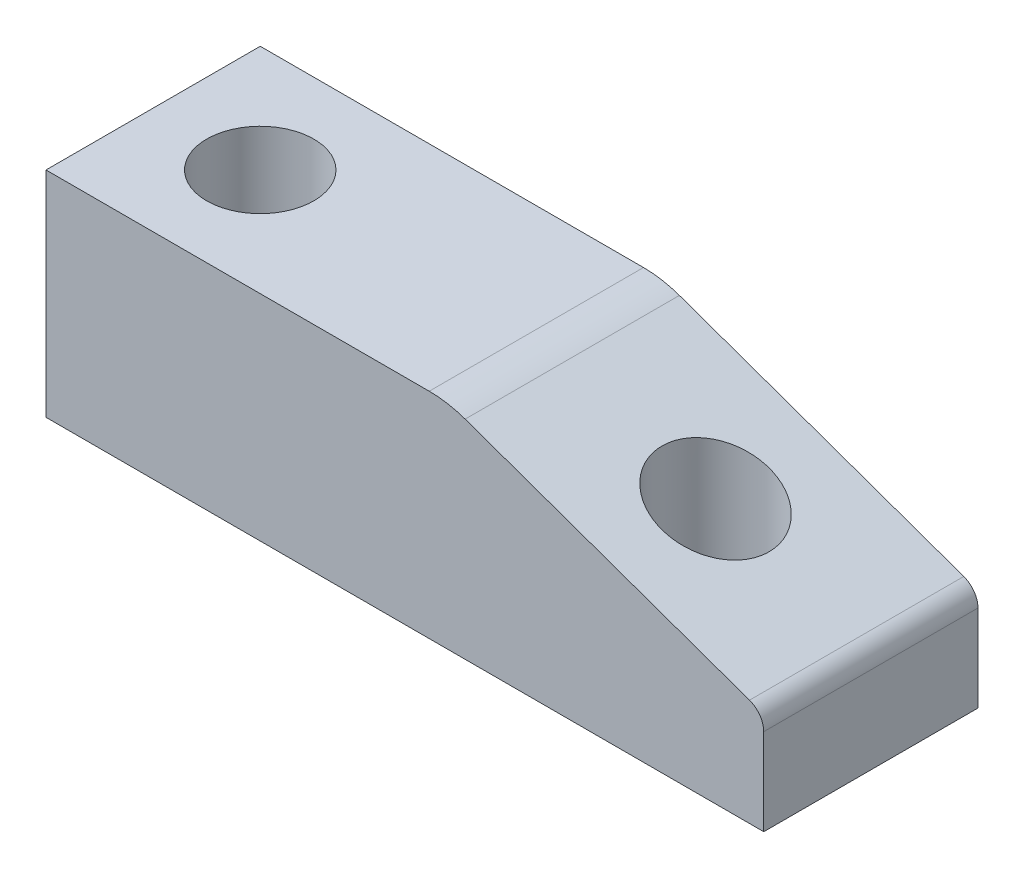
ISO-10303-21;
HEADER;
FILE_DESCRIPTION(('STEP AP214'),'2;1');
FILE_NAME('part.step','',(''),(''),'','','');
FILE_SCHEMA(('AUTOMOTIVE_DESIGN { 1 0 10303 214 1 1 1 1 }'));
ENDSEC;
DATA;
#1=APPLICATION_CONTEXT('core data for automotive mechanical design processes');
#2=APPLICATION_PROTOCOL_DEFINITION('international standard','automotive_design',2000,#1);
#3=PRODUCT_CONTEXT('',#1,'mechanical');
#4=PRODUCT('Part','Part','',(#3));
#5=PRODUCT_RELATED_PRODUCT_CATEGORY('part','',(#4));
#6=PRODUCT_DEFINITION_FORMATION('','',#4);
#7=PRODUCT_DEFINITION_CONTEXT('part definition',#1,'design');
#8=PRODUCT_DEFINITION('design','',#6,#7);
#9=PRODUCT_DEFINITION_SHAPE('','',#8);
#10=(LENGTH_UNIT() NAMED_UNIT(*) SI_UNIT(.MILLI.,.METRE.));
#11=(NAMED_UNIT(*) PLANE_ANGLE_UNIT() SI_UNIT($,.RADIAN.));
#12=(NAMED_UNIT(*) SI_UNIT($,.STERADIAN.) SOLID_ANGLE_UNIT());
#13=UNCERTAINTY_MEASURE_WITH_UNIT(LENGTH_MEASURE(1.E-05),#10,'distance_accuracy_value','');
#14=(GEOMETRIC_REPRESENTATION_CONTEXT(3) GLOBAL_UNCERTAINTY_ASSIGNED_CONTEXT((#13)) GLOBAL_UNIT_ASSIGNED_CONTEXT((#10,
#11,#12)) REPRESENTATION_CONTEXT('',''));
#15=CARTESIAN_POINT('',(0.,0.,0.));
#16=DIRECTION('',(0.,0.,1.));
#17=DIRECTION('',(1.,0.,0.));
#18=AXIS2_PLACEMENT_3D('',#15,#16,#17);
#19=CARTESIAN_POINT('',(0.,40.,-40.));
#20=DIRECTION('',(0.,0.,-1.));
#21=DIRECTION('',(-1.,0.,0.));
#22=AXIS2_PLACEMENT_3D('',#19,#20,#21);
#23=PLANE('',#22);
#24=DIRECTION('',(-0.942102631717715,0.335324665526644,0.));
#25=VECTOR('',#24,1.);
#26=CARTESIAN_POINT('',(134.,19.,-40.));
#27=LINE('',#26,#25);
#28=CARTESIAN_POINT('',(131.341298662107,19.9463174253519,-40.));
#29=VERTEX_POINT('',#28);
#30=CARTESIAN_POINT('',(78.253280693957,38.8420526343543,-40.));
#31=VERTEX_POINT('',#30);
#32=EDGE_CURVE('E136',#29,#31,#27,.T.);
#33=ORIENTED_EDGE('',*,*,#32,.F.);
#34=CARTESIAN_POINT('',(130.,16.177906898481,-40.));
#35=DIRECTION('',(0.,0.,-1.));
#36=DIRECTION('',(-1.,0.,0.));
#37=AXIS2_PLACEMENT_3D('',#34,#35,#36);
#38=CIRCLE('',#37,4.);
#39=CARTESIAN_POINT('',(134.,16.177906898481,-40.));
#40=VERTEX_POINT('',#39);
#41=EDGE_CURVE('E184',#29,#40,#38,.T.);
#42=ORIENTED_EDGE('',*,*,#41,.T.);
#43=DIRECTION('',(0.,-1.,0.));
#44=VECTOR('',#43,1.);
#45=CARTESIAN_POINT('',(134.,40.,-40.));
#46=LINE('',#45,#44);
#47=CARTESIAN_POINT('',(134.,0.,-40.));
#48=VERTEX_POINT('',#47);
#49=EDGE_CURVE('E111',#40,#48,#46,.T.);
#50=ORIENTED_EDGE('',*,*,#49,.T.);
#51=DIRECTION('',(1.,0.,0.));
#52=VECTOR('',#51,1.);
#53=CARTESIAN_POINT('',(0.,0.,-40.));
#54=LINE('',#53,#52);
#55=CARTESIAN_POINT('',(0.,0.,-40.));
#56=VERTEX_POINT('',#55);
#57=EDGE_CURVE('E110',#56,#48,#54,.T.);
#58=ORIENTED_EDGE('',*,*,#57,.F.);
#59=DIRECTION('',(0.,-1.,0.));
#60=VECTOR('',#59,1.);
#61=CARTESIAN_POINT('',(0.,40.,-40.));
#62=LINE('',#61,#60);
#63=CARTESIAN_POINT('',(0.,40.,-40.));
#64=VERTEX_POINT('',#63);
#65=EDGE_CURVE('E161',#64,#56,#62,.T.);
#66=ORIENTED_EDGE('',*,*,#65,.F.);
#67=DIRECTION('',(1.,0.,0.));
#68=VECTOR('',#67,1.);
#69=CARTESIAN_POINT('',(0.,40.,-40.));
#70=LINE('',#69,#68);
#71=CARTESIAN_POINT('',(71.5467873834241,40.,-40.));
#72=VERTEX_POINT('',#71);
#73=EDGE_CURVE('E143',#64,#72,#70,.T.);
#74=ORIENTED_EDGE('',*,*,#73,.T.);
#75=CARTESIAN_POINT('',(71.5467873834241,20.,-40.));
#76=DIRECTION('',(0.,0.,-1.));
#77=DIRECTION('',(-1.,0.,0.));
#78=AXIS2_PLACEMENT_3D('',#75,#76,#77);
#79=CIRCLE('',#78,20.);
#80=EDGE_CURVE('E174',#72,#31,#79,.T.);
#81=ORIENTED_EDGE('',*,*,#80,.T.);
#82=EDGE_LOOP('',(#33,#42,#50,#58,#66,#74,#81));
#83=FACE_BOUND('',#82,.T.);
#84=ADVANCED_FACE('F41',(#83),#23,.T.);
#85=CARTESIAN_POINT('',(0.,40.,0.));
#86=DIRECTION('',(0.,1.,0.));
#87=DIRECTION('',(0.,0.,1.));
#88=AXIS2_PLACEMENT_3D('',#85,#86,#87);
#89=PLANE('',#88);
#90=CARTESIAN_POINT('',(20.,40.,-20.));
#91=DIRECTION('',(0.,1.,0.));
#92=DIRECTION('',(0.,0.,1.));
#93=AXIS2_PLACEMENT_3D('',#90,#91,#92);
#94=CIRCLE('',#93,10.);
#95=CARTESIAN_POINT('',(20.,40.,-10.));
#96=VERTEX_POINT('',#95);
#97=EDGE_CURVE('E122',#96,#96,#94,.T.);
#98=ORIENTED_EDGE('',*,*,#97,.F.);
#99=EDGE_LOOP('',(#98));
#100=FACE_BOUND('',#99,.T.);
#101=DIRECTION('',(1.,0.,0.));
#102=VECTOR('',#101,1.);
#103=CARTESIAN_POINT('',(0.,40.,0.));
#104=LINE('',#103,#102);
#105=CARTESIAN_POINT('',(0.,40.,0.));
#106=VERTEX_POINT('',#105);
#107=CARTESIAN_POINT('',(71.5467873834241,40.,0.));
#108=VERTEX_POINT('',#107);
#109=EDGE_CURVE('E151',#106,#108,#104,.T.);
#110=ORIENTED_EDGE('',*,*,#109,.T.);
#111=DIRECTION('',(0.,0.,1.));
#112=VECTOR('',#111,1.);
#113=CARTESIAN_POINT('',(71.5467873834241,40.,0.));
#114=LINE('',#113,#112);
#115=EDGE_CURVE('E171',#108,#72,#114,.F.);
#116=ORIENTED_EDGE('',*,*,#115,.T.);
#117=ORIENTED_EDGE('',*,*,#73,.F.);
#118=DIRECTION('',(0.,0.,-1.));
#119=VECTOR('',#118,1.);
#120=CARTESIAN_POINT('',(0.,40.,0.));
#121=LINE('',#120,#119);
#122=EDGE_CURVE('E147',#106,#64,#121,.T.);
#123=ORIENTED_EDGE('',*,*,#122,.F.);
#124=EDGE_LOOP('',(#110,#116,#117,#123));
#125=FACE_BOUND('',#124,.T.);
#126=ADVANCED_FACE('F199',(#100,#125),#89,.T.);
#127=CARTESIAN_POINT('',(105.,40.,-20.));
#128=DIRECTION('',(0.,-1.,0.));
#129=DIRECTION('',(0.,0.,-1.));
#130=AXIS2_PLACEMENT_3D('',#127,#128,#129);
#131=CYLINDRICAL_SURFACE('',#130,9.99999999999999);
#132=CARTESIAN_POINT('',(105.,10.,-20.));
#133=DIRECTION('',(0.,1.,0.));
#134=DIRECTION('',(0.,0.,1.));
#135=AXIS2_PLACEMENT_3D('',#132,#133,#134);
#136=CIRCLE('',#135,9.99999999999999);
#137=CARTESIAN_POINT('',(105.,10.,-10.));
#138=VERTEX_POINT('',#137);
#139=EDGE_CURVE('E11',#138,#138,#136,.T.);
#140=ORIENTED_EDGE('',*,*,#139,.F.);
#141=EDGE_LOOP('',(#140));
#142=FACE_BOUND('',#141,.T.);
#143=CARTESIAN_POINT('',(105.,29.3220338983051,-20.));
#144=DIRECTION('',(0.335324665526644,0.942102631717715,0.));
#145=DIRECTION('',(0.942102631717715,-0.335324665526644,0.));
#146=AXIS2_PLACEMENT_3D('',#143,#144,#145);
#147=ELLIPSE('',#146,10.6145547876957,9.99999999999999);
#148=CARTESIAN_POINT('',(115.,25.7627118644068,-20.));
#149=VERTEX_POINT('',#148);
#150=EDGE_CURVE('E130',#149,#149,#147,.T.);
#151=ORIENTED_EDGE('',*,*,#150,.T.);
#152=EDGE_LOOP('',(#151));
#153=FACE_BOUND('',#152,.T.);
#154=ADVANCED_FACE('F202',(#142,#153),#131,.F.);
#155=CARTESIAN_POINT('',(134.,40.,0.));
#156=DIRECTION('',(-1.,0.,0.));
#157=DIRECTION('',(0.,0.,1.));
#158=AXIS2_PLACEMENT_3D('',#155,#156,#157);
#159=PLANE('',#158);
#160=ORIENTED_EDGE('',*,*,#49,.F.);
#161=DIRECTION('',(0.,0.,1.));
#162=VECTOR('',#161,1.);
#163=CARTESIAN_POINT('',(134.,16.177906898481,0.));
#164=LINE('',#163,#162);
#165=CARTESIAN_POINT('',(134.,16.177906898481,0.));
#166=VERTEX_POINT('',#165);
#167=EDGE_CURVE('E108',#40,#166,#164,.T.);
#168=ORIENTED_EDGE('',*,*,#167,.T.);
#169=DIRECTION('',(0.,-1.,0.));
#170=VECTOR('',#169,1.);
#171=CARTESIAN_POINT('',(134.,40.,0.));
#172=LINE('',#171,#170);
#173=CARTESIAN_POINT('',(134.,0.,0.));
#174=VERTEX_POINT('',#173);
#175=EDGE_CURVE('E101',#166,#174,#172,.T.);
#176=ORIENTED_EDGE('',*,*,#175,.T.);
#177=DIRECTION('',(0.,0.,-1.));
#178=VECTOR('',#177,1.);
#179=CARTESIAN_POINT('',(134.,0.,0.));
#180=LINE('',#179,#178);
#181=EDGE_CURVE('E106',#174,#48,#180,.T.);
#182=ORIENTED_EDGE('',*,*,#181,.T.);
#183=EDGE_LOOP('',(#160,#168,#176,#182));
#184=FACE_BOUND('',#183,.T.);
#185=ADVANCED_FACE('F104',(#184),#159,.F.);
#186=CARTESIAN_POINT('',(0.,40.,0.));
#187=DIRECTION('',(-1.,0.,0.));
#188=DIRECTION('',(0.,0.,1.));
#189=AXIS2_PLACEMENT_3D('',#186,#187,#188);
#190=PLANE('',#189);
#191=DIRECTION('',(0.,0.,-1.));
#192=VECTOR('',#191,1.);
#193=CARTESIAN_POINT('',(0.,0.,0.));
#194=LINE('',#193,#192);
#195=CARTESIAN_POINT('',(0.,0.,0.));
#196=VERTEX_POINT('',#195);
#197=EDGE_CURVE('E123',#196,#56,#194,.T.);
#198=ORIENTED_EDGE('',*,*,#197,.F.);
#199=DIRECTION('',(0.,-1.,0.));
#200=VECTOR('',#199,1.);
#201=CARTESIAN_POINT('',(0.,40.,0.));
#202=LINE('',#201,#200);
#203=EDGE_CURVE('E117',#106,#196,#202,.T.);
#204=ORIENTED_EDGE('',*,*,#203,.F.);
#205=ORIENTED_EDGE('',*,*,#122,.T.);
#206=ORIENTED_EDGE('',*,*,#65,.T.);
#207=EDGE_LOOP('',(#198,#204,#205,#206));
#208=FACE_BOUND('',#207,.T.);
#209=ADVANCED_FACE('F195',(#208),#190,.T.);
#210=CARTESIAN_POINT('',(20.,40.,-20.));
#211=DIRECTION('',(0.,-1.,0.));
#212=DIRECTION('',(0.,0.,-1.));
#213=AXIS2_PLACEMENT_3D('',#210,#211,#212);
#214=CYLINDRICAL_SURFACE('',#213,10.);
#215=CARTESIAN_POINT('',(20.,10.,-20.));
#216=DIRECTION('',(0.,1.,0.));
#217=DIRECTION('',(0.,0.,1.));
#218=AXIS2_PLACEMENT_3D('',#215,#216,#217);
#219=CIRCLE('',#218,10.);
#220=CARTESIAN_POINT('',(20.,10.,-10.));
#221=VERTEX_POINT('',#220);
#222=EDGE_CURVE('E50',#221,#221,#219,.T.);
#223=ORIENTED_EDGE('',*,*,#222,.F.);
#224=EDGE_LOOP('',(#223));
#225=FACE_BOUND('',#224,.T.);
#226=ORIENTED_EDGE('',*,*,#97,.T.);
#227=EDGE_LOOP('',(#226));
#228=FACE_BOUND('',#227,.T.);
#229=ADVANCED_FACE('F192',(#225,#228),#214,.F.);
#230=CARTESIAN_POINT('',(0.,40.,0.));
#231=DIRECTION('',(0.,0.,-1.));
#232=DIRECTION('',(-1.,0.,0.));
#233=AXIS2_PLACEMENT_3D('',#230,#231,#232);
#234=PLANE('',#233);
#235=ORIENTED_EDGE('',*,*,#175,.F.);
#236=CARTESIAN_POINT('',(130.,16.177906898481,0.));
#237=DIRECTION('',(0.,0.,-1.));
#238=DIRECTION('',(-1.,0.,0.));
#239=AXIS2_PLACEMENT_3D('',#236,#237,#238);
#240=CIRCLE('',#239,4.);
#241=CARTESIAN_POINT('',(131.341298662107,19.9463174253519,0.));
#242=VERTEX_POINT('',#241);
#243=EDGE_CURVE('E65',#166,#242,#240,.F.);
#244=ORIENTED_EDGE('',*,*,#243,.T.);
#245=DIRECTION('',(-0.942102631717715,0.335324665526644,0.));
#246=VECTOR('',#245,1.);
#247=CARTESIAN_POINT('',(134.,19.,0.));
#248=LINE('',#247,#246);
#249=CARTESIAN_POINT('',(78.253280693957,38.8420526343543,0.));
#250=VERTEX_POINT('',#249);
#251=EDGE_CURVE('E263',#242,#250,#248,.T.);
#252=ORIENTED_EDGE('',*,*,#251,.T.);
#253=CARTESIAN_POINT('',(71.5467873834241,20.,0.));
#254=DIRECTION('',(0.,0.,-1.));
#255=DIRECTION('',(-1.,0.,0.));
#256=AXIS2_PLACEMENT_3D('',#253,#254,#255);
#257=CIRCLE('',#256,20.);
#258=EDGE_CURVE('E168',#250,#108,#257,.F.);
#259=ORIENTED_EDGE('',*,*,#258,.T.);
#260=ORIENTED_EDGE('',*,*,#109,.F.);
#261=ORIENTED_EDGE('',*,*,#203,.T.);
#262=DIRECTION('',(1.,0.,0.));
#263=VECTOR('',#262,1.);
#264=CARTESIAN_POINT('',(0.,0.,0.));
#265=LINE('',#264,#263);
#266=EDGE_CURVE('E114',#196,#174,#265,.T.);
#267=ORIENTED_EDGE('',*,*,#266,.T.);
#268=EDGE_LOOP('',(#235,#244,#252,#259,#260,#261,#267));
#269=FACE_BOUND('',#268,.T.);
#270=ADVANCED_FACE('F115',(#269),#234,.F.);
#271=CARTESIAN_POINT('',(0.,0.,0.));
#272=DIRECTION('',(0.,1.,0.));
#273=DIRECTION('',(0.,0.,1.));
#274=AXIS2_PLACEMENT_3D('',#271,#272,#273);
#275=PLANE('',#274);
#276=ORIENTED_EDGE('',*,*,#57,.T.);
#277=ORIENTED_EDGE('',*,*,#181,.F.);
#278=ORIENTED_EDGE('',*,*,#266,.F.);
#279=ORIENTED_EDGE('',*,*,#197,.T.);
#280=EDGE_LOOP('',(#276,#277,#278,#279));
#281=FACE_BOUND('',#280,.T.);
#282=CARTESIAN_POINT('',(20.,0.,-20.));
#283=DIRECTION('',(0.,1.,0.));
#284=DIRECTION('',(0.,0.,1.));
#285=AXIS2_PLACEMENT_3D('',#282,#283,#284);
#286=CIRCLE('',#285,6.);
#287=CARTESIAN_POINT('',(20.,0.,-14.));
#288=VERTEX_POINT('',#287);
#289=EDGE_CURVE('E270',#288,#288,#286,.T.);
#290=ORIENTED_EDGE('',*,*,#289,.T.);
#291=EDGE_LOOP('',(#290));
#292=FACE_BOUND('',#291,.T.);
#293=CARTESIAN_POINT('',(105.,0.,-20.));
#294=DIRECTION('',(0.,1.,0.));
#295=DIRECTION('',(0.,0.,1.));
#296=AXIS2_PLACEMENT_3D('',#293,#294,#295);
#297=CIRCLE('',#296,6.);
#298=CARTESIAN_POINT('',(105.,0.,-14.));
#299=VERTEX_POINT('',#298);
#300=EDGE_CURVE('E276',#299,#299,#297,.T.);
#301=ORIENTED_EDGE('',*,*,#300,.T.);
#302=EDGE_LOOP('',(#301));
#303=FACE_BOUND('',#302,.T.);
#304=ADVANCED_FACE('F126',(#281,#292,#303),#275,.F.);
#305=CARTESIAN_POINT('',(134.,19.,-221.813778355767));
#306=DIRECTION('',(0.335324665526644,0.942102631717715,0.));
#307=DIRECTION('',(-0.942102631717715,0.335324665526644,0.));
#308=AXIS2_PLACEMENT_3D('',#305,#306,#307);
#309=PLANE('',#308);
#310=ORIENTED_EDGE('',*,*,#150,.F.);
#311=EDGE_LOOP('',(#310));
#312=FACE_BOUND('',#311,.T.);
#313=ORIENTED_EDGE('',*,*,#251,.F.);
#314=DIRECTION('',(0.,0.,1.));
#315=VECTOR('',#314,1.);
#316=CARTESIAN_POINT('',(131.341298662107,19.9463174253519,-40.));
#317=LINE('',#316,#315);
#318=EDGE_CURVE('E57',#242,#29,#317,.F.);
#319=ORIENTED_EDGE('',*,*,#318,.T.);
#320=ORIENTED_EDGE('',*,*,#32,.T.);
#321=DIRECTION('',(0.,0.,1.));
#322=VECTOR('',#321,1.);
#323=CARTESIAN_POINT('',(78.253280693957,38.8420526343543,-221.813778355767));
#324=LINE('',#323,#322);
#325=EDGE_CURVE('E164',#31,#250,#324,.T.);
#326=ORIENTED_EDGE('',*,*,#325,.T.);
#327=EDGE_LOOP('',(#313,#319,#320,#326));
#328=FACE_BOUND('',#327,.T.);
#329=ADVANCED_FACE('F224',(#312,#328),#309,.T.);
#330=CARTESIAN_POINT('',(71.5467873834241,20.,-221.813778355767));
#331=DIRECTION('',(0.,0.,1.));
#332=DIRECTION('',(1.,0.,0.));
#333=AXIS2_PLACEMENT_3D('',#330,#331,#332);
#334=CYLINDRICAL_SURFACE('',#333,20.);
#335=ORIENTED_EDGE('',*,*,#80,.F.);
#336=ORIENTED_EDGE('',*,*,#115,.F.);
#337=ORIENTED_EDGE('',*,*,#258,.F.);
#338=ORIENTED_EDGE('',*,*,#325,.F.);
#339=EDGE_LOOP('',(#335,#336,#337,#338));
#340=FACE_BOUND('',#339,.T.);
#341=ADVANCED_FACE('F210',(#340),#334,.T.);
#342=CARTESIAN_POINT('',(130.,16.177906898481,0.));
#343=DIRECTION('',(0.,0.,-1.));
#344=DIRECTION('',(-1.,0.,0.));
#345=AXIS2_PLACEMENT_3D('',#342,#343,#344);
#346=CYLINDRICAL_SURFACE('',#345,4.);
#347=ORIENTED_EDGE('',*,*,#41,.F.);
#348=ORIENTED_EDGE('',*,*,#318,.F.);
#349=ORIENTED_EDGE('',*,*,#243,.F.);
#350=ORIENTED_EDGE('',*,*,#167,.F.);
#351=EDGE_LOOP('',(#347,#348,#349,#350));
#352=FACE_BOUND('',#351,.T.);
#353=ADVANCED_FACE('F43',(#352),#346,.T.);
#354=CARTESIAN_POINT('',(20.,10.,-20.));
#355=DIRECTION('',(0.,-1.,0.));
#356=DIRECTION('',(0.,0.,-1.));
#357=AXIS2_PLACEMENT_3D('',#354,#355,#356);
#358=CYLINDRICAL_SURFACE('',#357,6.);
#359=CARTESIAN_POINT('',(20.,10.,-20.));
#360=DIRECTION('',(0.,1.,0.));
#361=DIRECTION('',(0.,0.,1.));
#362=AXIS2_PLACEMENT_3D('',#359,#360,#361);
#363=CIRCLE('',#362,6.);
#364=CARTESIAN_POINT('',(20.,10.,-14.));
#365=VERTEX_POINT('',#364);
#366=EDGE_CURVE('E265',#365,#365,#363,.T.);
#367=ORIENTED_EDGE('',*,*,#366,.T.);
#368=EDGE_LOOP('',(#367));
#369=FACE_BOUND('',#368,.T.);
#370=ORIENTED_EDGE('',*,*,#289,.F.);
#371=EDGE_LOOP('',(#370));
#372=FACE_BOUND('',#371,.T.);
#373=ADVANCED_FACE('F217',(#369,#372),#358,.F.);
#374=CARTESIAN_POINT('',(0.,10.,0.));
#375=DIRECTION('',(0.,1.,0.));
#376=DIRECTION('',(0.,0.,1.));
#377=AXIS2_PLACEMENT_3D('',#374,#375,#376);
#378=PLANE('',#377);
#379=ORIENTED_EDGE('',*,*,#366,.F.);
#380=EDGE_LOOP('',(#379));
#381=FACE_BOUND('',#380,.T.);
#382=ORIENTED_EDGE('',*,*,#222,.T.);
#383=EDGE_LOOP('',(#382));
#384=FACE_BOUND('',#383,.T.);
#385=ADVANCED_FACE('F190',(#381,#384),#378,.T.);
#386=CARTESIAN_POINT('',(105.,10.,-20.));
#387=DIRECTION('',(0.,-1.,0.));
#388=DIRECTION('',(0.,0.,-1.));
#389=AXIS2_PLACEMENT_3D('',#386,#387,#388);
#390=CYLINDRICAL_SURFACE('',#389,6.);
#391=CARTESIAN_POINT('',(105.,10.,-20.));
#392=DIRECTION('',(0.,1.,0.));
#393=DIRECTION('',(0.,0.,1.));
#394=AXIS2_PLACEMENT_3D('',#391,#392,#393);
#395=CIRCLE('',#394,6.);
#396=CARTESIAN_POINT('',(105.,10.,-14.));
#397=VERTEX_POINT('',#396);
#398=EDGE_CURVE('E259',#397,#397,#395,.T.);
#399=ORIENTED_EDGE('',*,*,#398,.T.);
#400=EDGE_LOOP('',(#399));
#401=FACE_BOUND('',#400,.T.);
#402=ORIENTED_EDGE('',*,*,#300,.F.);
#403=EDGE_LOOP('',(#402));
#404=FACE_BOUND('',#403,.T.);
#405=ADVANCED_FACE('F246',(#401,#404),#390,.F.);
#406=CARTESIAN_POINT('',(0.,10.,0.));
#407=DIRECTION('',(0.,1.,0.));
#408=DIRECTION('',(0.,0.,1.));
#409=AXIS2_PLACEMENT_3D('',#406,#407,#408);
#410=PLANE('',#409);
#411=ORIENTED_EDGE('',*,*,#398,.F.);
#412=EDGE_LOOP('',(#411));
#413=FACE_BOUND('',#412,.T.);
#414=ORIENTED_EDGE('',*,*,#139,.T.);
#415=EDGE_LOOP('',(#414));
#416=FACE_BOUND('',#415,.T.);
#417=ADVANCED_FACE('F250',(#413,#416),#410,.T.);
#418=CLOSED_SHELL('',(#84,#126,#154,#185,#209,#229,#270,#304,#329,#341,#353,#373,#385,#405,#417));
#419=MANIFOLD_SOLID_BREP('B2',#418);
#420=ADVANCED_BREP_SHAPE_REPRESENTATION('',(#18,#419),#14);
#421=SHAPE_DEFINITION_REPRESENTATION(#9,#420);
ENDSEC;
END-ISO-10303-21;
